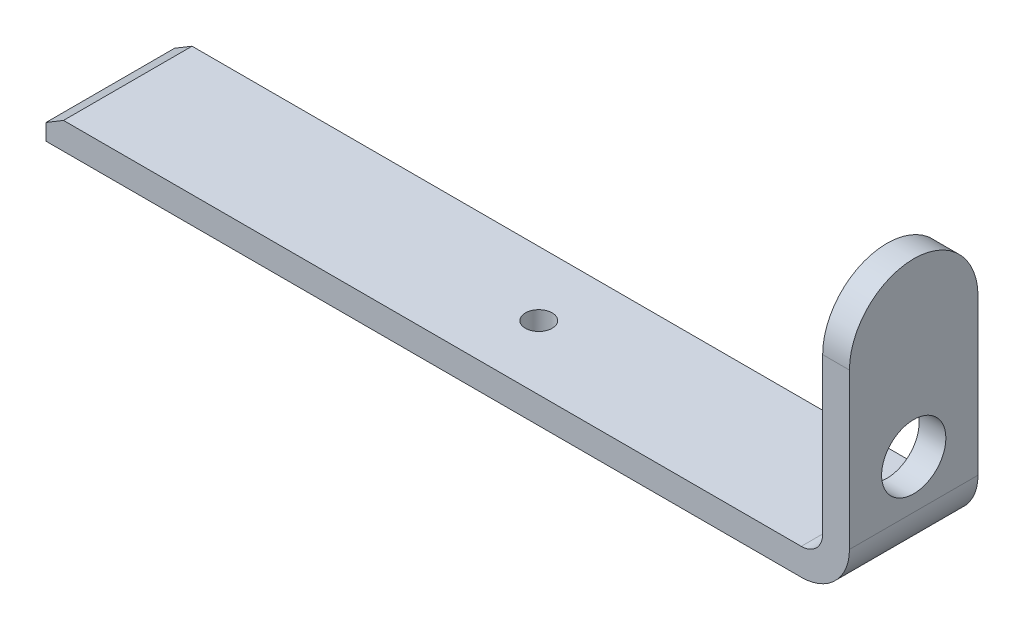
ISO-10303-21;
HEADER;
FILE_DESCRIPTION(('STEP AP214'),'2;1');
FILE_NAME('part.step','',(''),(''),'','','');
FILE_SCHEMA(('AUTOMOTIVE_DESIGN { 1 0 10303 214 1 1 1 1 }'));
ENDSEC;
DATA;
#1=APPLICATION_CONTEXT('core data for automotive mechanical design processes');
#2=APPLICATION_PROTOCOL_DEFINITION('international standard','automotive_design',2000,#1);
#3=PRODUCT_CONTEXT('',#1,'mechanical');
#4=PRODUCT('Part','Part','',(#3));
#5=PRODUCT_RELATED_PRODUCT_CATEGORY('part','',(#4));
#6=PRODUCT_DEFINITION_FORMATION('','',#4);
#7=PRODUCT_DEFINITION_CONTEXT('part definition',#1,'design');
#8=PRODUCT_DEFINITION('design','',#6,#7);
#9=PRODUCT_DEFINITION_SHAPE('','',#8);
#10=(LENGTH_UNIT() NAMED_UNIT(*) SI_UNIT(.MILLI.,.METRE.));
#11=(NAMED_UNIT(*) PLANE_ANGLE_UNIT() SI_UNIT($,.RADIAN.));
#12=(NAMED_UNIT(*) SI_UNIT($,.STERADIAN.) SOLID_ANGLE_UNIT());
#13=UNCERTAINTY_MEASURE_WITH_UNIT(LENGTH_MEASURE(1.E-05),#10,'distance_accuracy_value','');
#14=(GEOMETRIC_REPRESENTATION_CONTEXT(3) GLOBAL_UNCERTAINTY_ASSIGNED_CONTEXT((#13)) GLOBAL_UNIT_ASSIGNED_CONTEXT((#10,
#11,#12)) REPRESENTATION_CONTEXT('',''));
#15=CARTESIAN_POINT('',(0.,0.,0.));
#16=DIRECTION('',(0.,0.,1.));
#17=DIRECTION('',(1.,0.,0.));
#18=AXIS2_PLACEMENT_3D('',#15,#16,#17);
#19=CARTESIAN_POINT('',(-150.,22.056338028169,-13.1830985915493));
#20=DIRECTION('',(0.,0.,-1.));
#21=DIRECTION('',(0.,1.,0.));
#22=AXIS2_PLACEMENT_3D('',#19,#20,#21);
#23=PLANE('',#22);
#24=DIRECTION('',(-0.856853650803716,-0.515559716332011,0.));
#25=VECTOR('',#24,1.);
#26=CARTESIAN_POINT('',(-146.731773505265,-10.943661971831,-13.1830985915493));
#27=LINE('',#26,#25);
#28=CARTESIAN_POINT('',(-146.731773505265,-10.943661971831,-13.1830985915493));
#29=VERTEX_POINT('',#28);
#30=CARTESIAN_POINT('',(-150.,-12.9101190476153,-13.1830985915493));
#31=VERTEX_POINT('',#30);
#32=EDGE_CURVE('E114',#29,#31,#27,.T.);
#33=ORIENTED_EDGE('',*,*,#32,.F.);
#34=DIRECTION('',(-1.,0.,0.));
#35=VECTOR('',#34,1.);
#36=CARTESIAN_POINT('',(-9.00000000000004,-10.943661971831,-13.1830985915493));
#37=LINE('',#36,#35);
#38=CARTESIAN_POINT('',(-9.00000000000004,-10.943661971831,-13.1830985915493));
#39=VERTEX_POINT('',#38);
#40=EDGE_CURVE('E125',#39,#29,#37,.T.);
#41=ORIENTED_EDGE('',*,*,#40,.F.);
#42=CARTESIAN_POINT('',(-9.00000000000001,-6.94366197183103,-13.1830985915493));
#43=DIRECTION('',(0.,0.,-1.));
#44=DIRECTION('',(0.,-1.,0.));
#45=AXIS2_PLACEMENT_3D('',#42,#43,#44);
#46=CIRCLE('',#45,4.);
#47=CARTESIAN_POINT('',(-5.00000000000001,-6.943661971831,-13.1830985915493));
#48=VERTEX_POINT('',#47);
#49=EDGE_CURVE('E136',#48,#39,#46,.T.);
#50=ORIENTED_EDGE('',*,*,#49,.F.);
#51=DIRECTION('',(0.,-1.,0.));
#52=VECTOR('',#51,1.);
#53=CARTESIAN_POINT('',(-5.,34.056338028169,-13.1830985915493));
#54=LINE('',#53,#52);
#55=CARTESIAN_POINT('',(-5.,22.056338028169,-13.1830985915493));
#56=VERTEX_POINT('',#55);
#57=EDGE_CURVE('E141',#56,#48,#54,.T.);
#58=ORIENTED_EDGE('',*,*,#57,.F.);
#59=DIRECTION('',(1.,0.,0.));
#60=VECTOR('',#59,1.);
#61=CARTESIAN_POINT('',(-150.,22.056338028169,-13.1830985915493));
#62=LINE('',#61,#60);
#63=CARTESIAN_POINT('',(0.,22.056338028169,-13.1830985915493));
#64=VERTEX_POINT('',#63);
#65=EDGE_CURVE('E166',#56,#64,#62,.T.);
#66=ORIENTED_EDGE('',*,*,#65,.T.);
#67=DIRECTION('',(0.,1.,0.));
#68=VECTOR('',#67,1.);
#69=CARTESIAN_POINT('',(0.,22.056338028169,-13.1830985915493));
#70=LINE('',#69,#68);
#71=CARTESIAN_POINT('',(0.,-6.94366325164251,-13.1830985915493));
#72=VERTEX_POINT('',#71);
#73=EDGE_CURVE('E158',#72,#64,#70,.T.);
#74=ORIENTED_EDGE('',*,*,#73,.F.);
#75=CARTESIAN_POINT('',(-8.99999872451892,-6.94366325164251,-13.1830985915493));
#76=DIRECTION('',(0.,0.,1.));
#77=DIRECTION('',(0.,-1.,0.));
#78=AXIS2_PLACEMENT_3D('',#75,#76,#77);
#79=CIRCLE('',#78,8.99999872451892);
#80=CARTESIAN_POINT('',(-8.99971953413814,-15.943661971831,-13.1830985915493));
#81=VERTEX_POINT('',#80);
#82=EDGE_CURVE('E59',#81,#72,#79,.T.);
#83=ORIENTED_EDGE('',*,*,#82,.F.);
#84=DIRECTION('',(1.,0.,0.));
#85=VECTOR('',#84,1.);
#86=CARTESIAN_POINT('',(-150.,-15.943661971831,-13.1830985915493));
#87=LINE('',#86,#85);
#88=CARTESIAN_POINT('',(-150.,-15.943661971831,-13.1830985915493));
#89=VERTEX_POINT('',#88);
#90=EDGE_CURVE('E173',#89,#81,#87,.T.);
#91=ORIENTED_EDGE('',*,*,#90,.F.);
#92=DIRECTION('',(0.,1.,0.));
#93=VECTOR('',#92,1.);
#94=CARTESIAN_POINT('',(-150.,22.056338028169,-13.1830985915493));
#95=LINE('',#94,#93);
#96=EDGE_CURVE('E127',#89,#31,#95,.T.);
#97=ORIENTED_EDGE('',*,*,#96,.T.);
#98=EDGE_LOOP('',(#33,#41,#50,#58,#66,#74,#83,#91,#97));
#99=FACE_BOUND('',#98,.T.);
#100=ADVANCED_FACE('F46',(#99),#23,.T.);
#101=CARTESIAN_POINT('',(-150.,-15.943661971831,10.8169014084507));
#102=DIRECTION('',(0.,-1.,0.));
#103=DIRECTION('',(0.,0.,-1.));
#104=AXIS2_PLACEMENT_3D('',#101,#102,#103);
#105=PLANE('',#104);
#106=CARTESIAN_POINT('',(-70.,-15.943661971831,-1.18309859154927));
#107=DIRECTION('',(0.,-1.,0.));
#108=DIRECTION('',(0.,0.,-1.));
#109=AXIS2_PLACEMENT_3D('',#106,#107,#108);
#110=CIRCLE('',#109,2.50000000000001);
#111=CARTESIAN_POINT('',(-70.,-15.943661971831,-3.68309859154928));
#112=VERTEX_POINT('',#111);
#113=EDGE_CURVE('E213',#112,#112,#110,.T.);
#114=ORIENTED_EDGE('',*,*,#113,.F.);
#115=EDGE_LOOP('',(#114));
#116=FACE_BOUND('',#115,.T.);
#117=DIRECTION('',(0.,0.,-1.));
#118=VECTOR('',#117,1.);
#119=CARTESIAN_POINT('',(-8.99971953413814,-15.9436619718311,136.816901408451));
#120=LINE('',#119,#118);
#121=CARTESIAN_POINT('',(-8.99971953413814,-15.943661971831,10.8169014084507));
#122=VERTEX_POINT('',#121);
#123=EDGE_CURVE('E211',#122,#81,#120,.T.);
#124=ORIENTED_EDGE('',*,*,#123,.F.);
#125=DIRECTION('',(1.,0.,0.));
#126=VECTOR('',#125,1.);
#127=CARTESIAN_POINT('',(-150.,-15.943661971831,10.8169014084507));
#128=LINE('',#127,#126);
#129=CARTESIAN_POINT('',(-150.,-15.943661971831,10.8169014084507));
#130=VERTEX_POINT('',#129);
#131=EDGE_CURVE('E176',#130,#122,#128,.T.);
#132=ORIENTED_EDGE('',*,*,#131,.F.);
#133=DIRECTION('',(0.,0.,-1.));
#134=VECTOR('',#133,1.);
#135=CARTESIAN_POINT('',(-150.,-15.943661971831,10.8169014084507));
#136=LINE('',#135,#134);
#137=EDGE_CURVE('E163',#130,#89,#136,.T.);
#138=ORIENTED_EDGE('',*,*,#137,.T.);
#139=ORIENTED_EDGE('',*,*,#90,.T.);
#140=EDGE_LOOP('',(#124,#132,#138,#139));
#141=FACE_BOUND('',#140,.T.);
#142=ADVANCED_FACE('F234',(#116,#141),#105,.T.);
#143=CARTESIAN_POINT('',(-150.,22.056338028169,10.8169014084507));
#144=DIRECTION('',(0.,0.,1.));
#145=DIRECTION('',(0.,-1.,0.));
#146=AXIS2_PLACEMENT_3D('',#143,#144,#145);
#147=PLANE('',#146);
#148=DIRECTION('',(0.856853650803716,0.515559716332011,0.));
#149=VECTOR('',#148,1.);
#150=CARTESIAN_POINT('',(-134.553245016086,-3.615971079305,10.8169014084507));
#151=LINE('',#150,#149);
#152=CARTESIAN_POINT('',(-150.,-12.9101190476153,10.8169014084507));
#153=VERTEX_POINT('',#152);
#154=CARTESIAN_POINT('',(-146.731773505264,-10.943661971831,10.8169014084507));
#155=VERTEX_POINT('',#154);
#156=EDGE_CURVE('E67',#153,#155,#151,.T.);
#157=ORIENTED_EDGE('',*,*,#156,.F.);
#158=DIRECTION('',(0.,-1.,0.));
#159=VECTOR('',#158,1.);
#160=CARTESIAN_POINT('',(-150.,22.056338028169,10.8169014084507));
#161=LINE('',#160,#159);
#162=EDGE_CURVE('E160',#153,#130,#161,.T.);
#163=ORIENTED_EDGE('',*,*,#162,.T.);
#164=ORIENTED_EDGE('',*,*,#131,.T.);
#165=CARTESIAN_POINT('',(-8.99999872451892,-6.94366325164252,10.8169014084507));
#166=DIRECTION('',(0.,0.,1.));
#167=DIRECTION('',(0.,-1.,0.));
#168=AXIS2_PLACEMENT_3D('',#165,#166,#167);
#169=CIRCLE('',#168,8.99999872451892);
#170=CARTESIAN_POINT('',(0.,-6.94366325164252,10.8169014084507));
#171=VERTEX_POINT('',#170);
#172=EDGE_CURVE('E206',#171,#122,#169,.F.);
#173=ORIENTED_EDGE('',*,*,#172,.F.);
#174=DIRECTION('',(0.,-1.,0.));
#175=VECTOR('',#174,1.);
#176=CARTESIAN_POINT('',(0.,22.056338028169,10.8169014084507));
#177=LINE('',#176,#175);
#178=CARTESIAN_POINT('',(0.,22.056338028169,10.8169014084507));
#179=VERTEX_POINT('',#178);
#180=EDGE_CURVE('E161',#179,#171,#177,.T.);
#181=ORIENTED_EDGE('',*,*,#180,.F.);
#182=DIRECTION('',(1.,0.,0.));
#183=VECTOR('',#182,1.);
#184=CARTESIAN_POINT('',(-150.,22.056338028169,10.8169014084507));
#185=LINE('',#184,#183);
#186=CARTESIAN_POINT('',(-5.,22.056338028169,10.8169014084507));
#187=VERTEX_POINT('',#186);
#188=EDGE_CURVE('E179',#187,#179,#185,.T.);
#189=ORIENTED_EDGE('',*,*,#188,.F.);
#190=DIRECTION('',(0.,1.,0.));
#191=VECTOR('',#190,1.);
#192=CARTESIAN_POINT('',(-5.,22.056338028169,10.8169014084507));
#193=LINE('',#192,#191);
#194=CARTESIAN_POINT('',(-5.00000000000001,-6.94366197183101,10.8169014084507));
#195=VERTEX_POINT('',#194);
#196=EDGE_CURVE('E150',#195,#187,#193,.T.);
#197=ORIENTED_EDGE('',*,*,#196,.F.);
#198=CARTESIAN_POINT('',(-9.00000000000001,-6.94366197183103,10.8169014084507));
#199=DIRECTION('',(0.,0.,1.));
#200=DIRECTION('',(0.,-1.,0.));
#201=AXIS2_PLACEMENT_3D('',#198,#199,#200);
#202=CIRCLE('',#201,4.);
#203=CARTESIAN_POINT('',(-9.00000000000004,-10.943661971831,10.8169014084507));
#204=VERTEX_POINT('',#203);
#205=EDGE_CURVE('E120',#204,#195,#202,.T.);
#206=ORIENTED_EDGE('',*,*,#205,.F.);
#207=DIRECTION('',(1.,0.,0.));
#208=VECTOR('',#207,1.);
#209=CARTESIAN_POINT('',(-150.,-10.943661971831,10.8169014084507));
#210=LINE('',#209,#208);
#211=EDGE_CURVE('E152',#155,#204,#210,.T.);
#212=ORIENTED_EDGE('',*,*,#211,.F.);
#213=EDGE_LOOP('',(#157,#163,#164,#173,#181,#189,#197,#206,#212));
#214=FACE_BOUND('',#213,.T.);
#215=ADVANCED_FACE('F198',(#214),#147,.T.);
#216=CARTESIAN_POINT('',(-150.,22.056338028169,-1.18309859154927));
#217=DIRECTION('',(1.,0.,0.));
#218=DIRECTION('',(0.,0.,-1.));
#219=AXIS2_PLACEMENT_3D('',#216,#217,#218);
#220=CYLINDRICAL_SURFACE('',#219,12.);
#221=ORIENTED_EDGE('',*,*,#65,.F.);
#222=CARTESIAN_POINT('',(-5.,22.056338028169,-1.18309859154927));
#223=DIRECTION('',(1.,0.,0.));
#224=DIRECTION('',(0.,1.,0.));
#225=AXIS2_PLACEMENT_3D('',#222,#223,#224);
#226=CIRCLE('',#225,12.);
#227=EDGE_CURVE('E148',#187,#56,#226,.F.);
#228=ORIENTED_EDGE('',*,*,#227,.F.);
#229=ORIENTED_EDGE('',*,*,#188,.T.);
#230=CARTESIAN_POINT('',(0.,22.056338028169,-1.18309859154927));
#231=DIRECTION('',(1.,0.,0.));
#232=DIRECTION('',(0.,0.,-1.));
#233=AXIS2_PLACEMENT_3D('',#230,#231,#232);
#234=CIRCLE('',#233,12.);
#235=EDGE_CURVE('E168',#64,#179,#234,.T.);
#236=ORIENTED_EDGE('',*,*,#235,.F.);
#237=EDGE_LOOP('',(#221,#228,#229,#236));
#238=FACE_BOUND('',#237,.T.);
#239=ADVANCED_FACE('F204',(#238),#220,.T.);
#240=CARTESIAN_POINT('',(-150.,22.056338028169,-1.18309859154927));
#241=DIRECTION('',(1.,0.,0.));
#242=DIRECTION('',(0.,0.,-1.));
#243=AXIS2_PLACEMENT_3D('',#240,#241,#242);
#244=PLANE('',#243);
#245=ORIENTED_EDGE('',*,*,#162,.F.);
#246=DIRECTION('',(0.,0.,-1.));
#247=VECTOR('',#246,1.);
#248=CARTESIAN_POINT('',(-150.,-12.9101190476153,136.816901408451));
#249=LINE('',#248,#247);
#250=EDGE_CURVE('E128',#153,#31,#249,.T.);
#251=ORIENTED_EDGE('',*,*,#250,.T.);
#252=ORIENTED_EDGE('',*,*,#96,.F.);
#253=ORIENTED_EDGE('',*,*,#137,.F.);
#254=EDGE_LOOP('',(#245,#251,#252,#253));
#255=FACE_BOUND('',#254,.T.);
#256=ADVANCED_FACE('F250',(#255),#244,.F.);
#257=CARTESIAN_POINT('',(0.,22.056338028169,-1.18309859154927));
#258=DIRECTION('',(1.,0.,0.));
#259=DIRECTION('',(0.,0.,-1.));
#260=AXIS2_PLACEMENT_3D('',#257,#258,#259);
#261=PLANE('',#260);
#262=DIRECTION('',(0.,0.,-1.));
#263=VECTOR('',#262,1.);
#264=CARTESIAN_POINT('',(0.,-6.94366325164254,136.816901408451));
#265=LINE('',#264,#263);
#266=EDGE_CURVE('E11',#72,#171,#265,.F.);
#267=ORIENTED_EDGE('',*,*,#266,.F.);
#268=ORIENTED_EDGE('',*,*,#73,.T.);
#269=ORIENTED_EDGE('',*,*,#235,.T.);
#270=ORIENTED_EDGE('',*,*,#180,.T.);
#271=EDGE_LOOP('',(#267,#268,#269,#270));
#272=FACE_BOUND('',#271,.T.);
#273=CARTESIAN_POINT('',(0.,2.05633802816897,-1.18309859154927));
#274=DIRECTION('',(1.,0.,0.));
#275=DIRECTION('',(0.,0.,-1.));
#276=AXIS2_PLACEMENT_3D('',#273,#274,#275);
#277=CIRCLE('',#276,6.);
#278=CARTESIAN_POINT('',(0.,2.05633802816897,-7.18309859154927));
#279=VERTEX_POINT('',#278);
#280=EDGE_CURVE('E155',#279,#279,#277,.T.);
#281=ORIENTED_EDGE('',*,*,#280,.F.);
#282=EDGE_LOOP('',(#281));
#283=FACE_BOUND('',#282,.T.);
#284=ADVANCED_FACE('F247',(#272,#283),#261,.T.);
#285=CARTESIAN_POINT('',(-150.,2.05633802816897,-1.18309859154927));
#286=DIRECTION('',(1.,0.,0.));
#287=DIRECTION('',(0.,0.,-1.));
#288=AXIS2_PLACEMENT_3D('',#285,#286,#287);
#289=CYLINDRICAL_SURFACE('',#288,6.);
#290=CARTESIAN_POINT('',(-5.,2.05633802816897,-1.18309859154927));
#291=DIRECTION('',(1.,0.,0.));
#292=DIRECTION('',(0.,1.,0.));
#293=AXIS2_PLACEMENT_3D('',#290,#291,#292);
#294=CIRCLE('',#293,6.);
#295=CARTESIAN_POINT('',(-5.,8.05633802816897,-1.18309859154927));
#296=VERTEX_POINT('',#295);
#297=EDGE_CURVE('E146',#296,#296,#294,.F.);
#298=ORIENTED_EDGE('',*,*,#297,.T.);
#299=EDGE_LOOP('',(#298));
#300=FACE_BOUND('',#299,.T.);
#301=ORIENTED_EDGE('',*,*,#280,.T.);
#302=EDGE_LOOP('',(#301));
#303=FACE_BOUND('',#302,.T.);
#304=ADVANCED_FACE('F230',(#300,#303),#289,.F.);
#305=CARTESIAN_POINT('',(-5.,34.0563380281689,136.816901408451));
#306=DIRECTION('',(1.,0.,0.));
#307=DIRECTION('',(0.,1.,0.));
#308=AXIS2_PLACEMENT_3D('',#305,#306,#307);
#309=PLANE('',#308);
#310=ORIENTED_EDGE('',*,*,#196,.T.);
#311=ORIENTED_EDGE('',*,*,#227,.T.);
#312=ORIENTED_EDGE('',*,*,#57,.T.);
#313=DIRECTION('',(0.,0.,-1.));
#314=VECTOR('',#313,1.);
#315=CARTESIAN_POINT('',(-5.00000000000001,-6.94366197183103,136.816901408451));
#316=LINE('',#315,#314);
#317=EDGE_CURVE('E135',#195,#48,#316,.T.);
#318=ORIENTED_EDGE('',*,*,#317,.F.);
#319=EDGE_LOOP('',(#310,#311,#312,#318));
#320=FACE_BOUND('',#319,.T.);
#321=ORIENTED_EDGE('',*,*,#297,.F.);
#322=EDGE_LOOP('',(#321));
#323=FACE_BOUND('',#322,.T.);
#324=ADVANCED_FACE('F193',(#320,#323),#309,.F.);
#325=CARTESIAN_POINT('',(-9.00000000000004,-10.9436619718311,136.816901408451));
#326=DIRECTION('',(0.,-1.,0.));
#327=DIRECTION('',(1.,0.,0.));
#328=AXIS2_PLACEMENT_3D('',#325,#326,#327);
#329=PLANE('',#328);
#330=CARTESIAN_POINT('',(-70.,-10.943661971831,-1.18309859154927));
#331=DIRECTION('',(0.,1.,0.));
#332=DIRECTION('',(-1.,0.,0.));
#333=AXIS2_PLACEMENT_3D('',#330,#331,#332);
#334=CIRCLE('',#333,2.50000000000001);
#335=CARTESIAN_POINT('',(-72.5,-10.943661971831,-1.18309859154927));
#336=VERTEX_POINT('',#335);
#337=EDGE_CURVE('E217',#336,#336,#334,.T.);
#338=ORIENTED_EDGE('',*,*,#337,.F.);
#339=EDGE_LOOP('',(#338));
#340=FACE_BOUND('',#339,.T.);
#341=ORIENTED_EDGE('',*,*,#40,.T.);
#342=DIRECTION('',(0.,0.,1.));
#343=VECTOR('',#342,1.);
#344=CARTESIAN_POINT('',(-146.731773505264,-10.943661971831,136.816901408451));
#345=LINE('',#344,#343);
#346=EDGE_CURVE('E53',#29,#155,#345,.T.);
#347=ORIENTED_EDGE('',*,*,#346,.T.);
#348=ORIENTED_EDGE('',*,*,#211,.T.);
#349=DIRECTION('',(0.,0.,-1.));
#350=VECTOR('',#349,1.);
#351=CARTESIAN_POINT('',(-9.00000000000004,-10.9436619718311,136.816901408451));
#352=LINE('',#351,#350);
#353=EDGE_CURVE('E132',#204,#39,#352,.T.);
#354=ORIENTED_EDGE('',*,*,#353,.T.);
#355=EDGE_LOOP('',(#341,#347,#348,#354));
#356=FACE_BOUND('',#355,.T.);
#357=ADVANCED_FACE('F130',(#340,#356),#329,.F.);
#358=CARTESIAN_POINT('',(-9.00000000000001,-6.94366197183106,136.816901408451));
#359=DIRECTION('',(0.,0.,-1.));
#360=DIRECTION('',(0.,1.,0.));
#361=AXIS2_PLACEMENT_3D('',#358,#359,#360);
#362=CYLINDRICAL_SURFACE('',#361,4.);
#363=ORIENTED_EDGE('',*,*,#205,.T.);
#364=ORIENTED_EDGE('',*,*,#317,.T.);
#365=ORIENTED_EDGE('',*,*,#49,.T.);
#366=ORIENTED_EDGE('',*,*,#353,.F.);
#367=EDGE_LOOP('',(#363,#364,#365,#366));
#368=FACE_BOUND('',#367,.T.);
#369=ADVANCED_FACE('F188',(#368),#362,.F.);
#370=CARTESIAN_POINT('',(-146.731773505265,-10.9436619718311,136.816901408451));
#371=DIRECTION('',(0.515559716332011,-0.856853650803716,0.));
#372=DIRECTION('',(0.856853650803716,0.515559716332011,0.));
#373=AXIS2_PLACEMENT_3D('',#370,#371,#372);
#374=PLANE('',#373);
#375=ORIENTED_EDGE('',*,*,#156,.T.);
#376=ORIENTED_EDGE('',*,*,#346,.F.);
#377=ORIENTED_EDGE('',*,*,#32,.T.);
#378=ORIENTED_EDGE('',*,*,#250,.F.);
#379=EDGE_LOOP('',(#375,#376,#377,#378));
#380=FACE_BOUND('',#379,.T.);
#381=ADVANCED_FACE('F113',(#380),#374,.F.);
#382=CARTESIAN_POINT('',(-8.99999872451892,-6.94366325164254,136.816901408451));
#383=DIRECTION('',(0.,0.,-1.));
#384=DIRECTION('',(0.,1.,0.));
#385=AXIS2_PLACEMENT_3D('',#382,#383,#384);
#386=CYLINDRICAL_SURFACE('',#385,8.99999872451892);
#387=ORIENTED_EDGE('',*,*,#172,.T.);
#388=ORIENTED_EDGE('',*,*,#123,.T.);
#389=ORIENTED_EDGE('',*,*,#82,.T.);
#390=ORIENTED_EDGE('',*,*,#266,.T.);
#391=EDGE_LOOP('',(#387,#388,#389,#390));
#392=FACE_BOUND('',#391,.T.);
#393=ADVANCED_FACE('F319',(#392),#386,.T.);
#394=CARTESIAN_POINT('',(-70.,-160.943661971831,-1.1830985915493));
#395=DIRECTION('',(0.,1.,0.));
#396=DIRECTION('',(-1.,0.,0.));
#397=AXIS2_PLACEMENT_3D('',#394,#395,#396);
#398=CYLINDRICAL_SURFACE('',#397,2.50000000000001);
#399=ORIENTED_EDGE('',*,*,#113,.T.);
#400=EDGE_LOOP('',(#399));
#401=FACE_BOUND('',#400,.T.);
#402=ORIENTED_EDGE('',*,*,#337,.T.);
#403=EDGE_LOOP('',(#402));
#404=FACE_BOUND('',#403,.T.);
#405=ADVANCED_FACE('F221',(#401,#404),#398,.F.);
#406=CLOSED_SHELL('',(#100,#142,#215,#239,#256,#284,#304,#324,#357,#369,#381,#393,#405));
#407=MANIFOLD_SOLID_BREP('B2',#406);
#408=ADVANCED_BREP_SHAPE_REPRESENTATION('',(#18,#407),#14);
#409=SHAPE_DEFINITION_REPRESENTATION(#9,#408);
ENDSEC;
END-ISO-10303-21;
